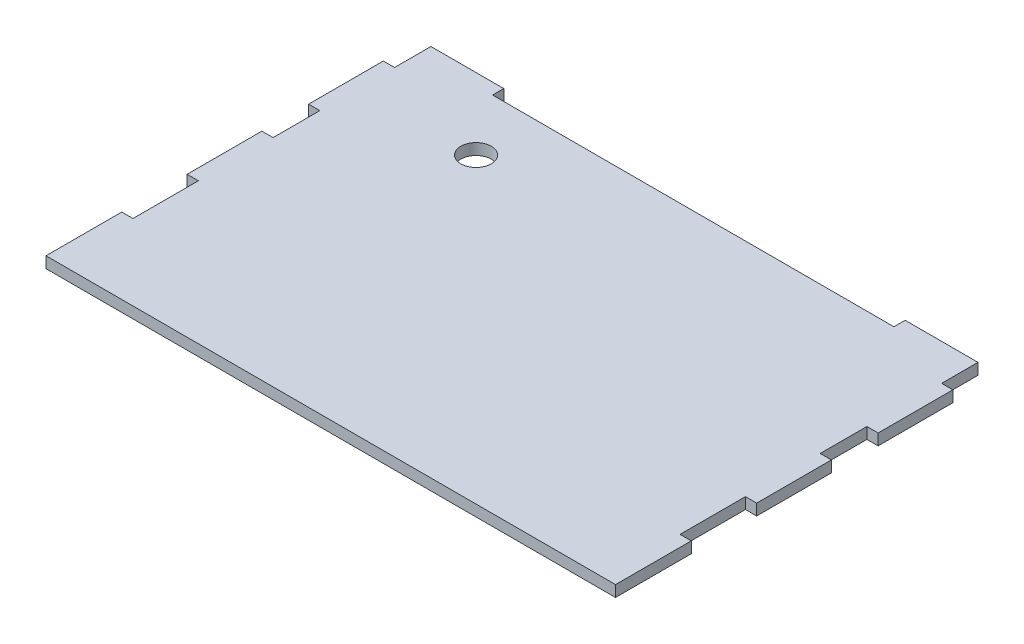
ISO-10303-21;
HEADER;
FILE_DESCRIPTION(('STEP AP214'),'2;1');
FILE_NAME('part.step','',(''),(''),'','','');
FILE_SCHEMA(('AUTOMOTIVE_DESIGN { 1 0 10303 214 1 1 1 1 }'));
ENDSEC;
DATA;
#1=APPLICATION_CONTEXT('core data for automotive mechanical design processes');
#2=APPLICATION_PROTOCOL_DEFINITION('international standard','automotive_design',2000,#1);
#3=PRODUCT_CONTEXT('',#1,'mechanical');
#4=PRODUCT('Part','Part','',(#3));
#5=PRODUCT_RELATED_PRODUCT_CATEGORY('part','',(#4));
#6=PRODUCT_DEFINITION_FORMATION('','',#4);
#7=PRODUCT_DEFINITION_CONTEXT('part definition',#1,'design');
#8=PRODUCT_DEFINITION('design','',#6,#7);
#9=PRODUCT_DEFINITION_SHAPE('','',#8);
#10=(LENGTH_UNIT() NAMED_UNIT(*) SI_UNIT(.MILLI.,.METRE.));
#11=(NAMED_UNIT(*) PLANE_ANGLE_UNIT() SI_UNIT($,.RADIAN.));
#12=(NAMED_UNIT(*) SI_UNIT($,.STERADIAN.) SOLID_ANGLE_UNIT());
#13=UNCERTAINTY_MEASURE_WITH_UNIT(LENGTH_MEASURE(1.E-05),#10,'distance_accuracy_value','');
#14=(GEOMETRIC_REPRESENTATION_CONTEXT(3) GLOBAL_UNCERTAINTY_ASSIGNED_CONTEXT((#13)) GLOBAL_UNIT_ASSIGNED_CONTEXT((#10,
#11,#12)) REPRESENTATION_CONTEXT('',''));
#15=CARTESIAN_POINT('',(0.,0.,0.));
#16=DIRECTION('',(0.,0.,1.));
#17=DIRECTION('',(1.,0.,0.));
#18=AXIS2_PLACEMENT_3D('',#15,#16,#17);
#19=CARTESIAN_POINT('',(124.827586206897,6.,95.5172413793103));
#20=DIRECTION('',(-1.,0.,0.));
#21=DIRECTION('',(0.,0.,1.));
#22=AXIS2_PLACEMENT_3D('',#19,#20,#21);
#23=PLANE('',#22);
#24=DIRECTION('',(0.,0.,-1.));
#25=VECTOR('',#24,1.);
#26=CARTESIAN_POINT('',(124.827586206897,0.,95.5172413793103));
#27=LINE('',#26,#25);
#28=CARTESIAN_POINT('',(124.827586206897,0.,95.5172413793103));
#29=VERTEX_POINT('',#28);
#30=CARTESIAN_POINT('',(124.827586206896,0.,54.9772413793103));
#31=VERTEX_POINT('',#30);
#32=EDGE_CURVE('E265',#29,#31,#27,.T.);
#33=ORIENTED_EDGE('',*,*,#32,.T.);
#34=DIRECTION('',(0.,-1.,0.));
#35=VECTOR('',#34,1.);
#36=CARTESIAN_POINT('',(124.827586206896,6.,54.9772413793103));
#37=LINE('',#36,#35);
#38=CARTESIAN_POINT('',(124.827586206896,6.,54.9772413793103));
#39=VERTEX_POINT('',#38);
#40=EDGE_CURVE('E11',#39,#31,#37,.T.);
#41=ORIENTED_EDGE('',*,*,#40,.F.);
#42=DIRECTION('',(0.,0.,-1.));
#43=VECTOR('',#42,1.);
#44=CARTESIAN_POINT('',(124.827586206897,6.,95.5172413793103));
#45=LINE('',#44,#43);
#46=CARTESIAN_POINT('',(124.827586206897,6.,95.5172413793103));
#47=VERTEX_POINT('',#46);
#48=EDGE_CURVE('E348',#47,#39,#45,.T.);
#49=ORIENTED_EDGE('',*,*,#48,.F.);
#50=DIRECTION('',(0.,-1.,0.));
#51=VECTOR('',#50,1.);
#52=CARTESIAN_POINT('',(124.827586206897,6.,95.5172413793103));
#53=LINE('',#52,#51);
#54=EDGE_CURVE('E261',#47,#29,#53,.T.);
#55=ORIENTED_EDGE('',*,*,#54,.T.);
#56=EDGE_LOOP('',(#33,#41,#49,#55));
#57=FACE_BOUND('',#56,.T.);
#58=ADVANCED_FACE('F44',(#57),#23,.F.);
#59=CARTESIAN_POINT('',(124.827586206896,6.,54.9772413793103));
#60=DIRECTION('',(0.,0.,1.));
#61=DIRECTION('',(1.,0.,0.));
#62=AXIS2_PLACEMENT_3D('',#59,#60,#61);
#63=PLANE('',#62);
#64=DIRECTION('',(-1.,0.,0.));
#65=VECTOR('',#64,1.);
#66=CARTESIAN_POINT('',(124.827586206896,0.,54.9772413793103));
#67=LINE('',#66,#65);
#68=CARTESIAN_POINT('',(118.827586206897,0.,54.9772413793103));
#69=VERTEX_POINT('',#68);
#70=EDGE_CURVE('E269',#31,#69,#67,.T.);
#71=ORIENTED_EDGE('',*,*,#70,.T.);
#72=DIRECTION('',(0.,-1.,0.));
#73=VECTOR('',#72,1.);
#74=CARTESIAN_POINT('',(118.827586206897,6.,54.9772413793103));
#75=LINE('',#74,#73);
#76=CARTESIAN_POINT('',(118.827586206897,6.,54.9772413793103));
#77=VERTEX_POINT('',#76);
#78=EDGE_CURVE('E53',#77,#69,#75,.T.);
#79=ORIENTED_EDGE('',*,*,#78,.F.);
#80=DIRECTION('',(-1.,0.,0.));
#81=VECTOR('',#80,1.);
#82=CARTESIAN_POINT('',(124.827586206896,6.,54.9772413793103));
#83=LINE('',#82,#81);
#84=EDGE_CURVE('E164',#39,#77,#83,.T.);
#85=ORIENTED_EDGE('',*,*,#84,.F.);
#86=ORIENTED_EDGE('',*,*,#40,.T.);
#87=EDGE_LOOP('',(#71,#79,#85,#86));
#88=FACE_BOUND('',#87,.T.);
#89=ADVANCED_FACE('F555',(#88),#63,.F.);
#90=CARTESIAN_POINT('',(118.827586206897,6.,54.9772413793103));
#91=DIRECTION('',(-1.,0.,0.));
#92=DIRECTION('',(0.,0.,1.));
#93=AXIS2_PLACEMENT_3D('',#90,#91,#92);
#94=PLANE('',#93);
#95=DIRECTION('',(0.,0.,-1.));
#96=VECTOR('',#95,1.);
#97=CARTESIAN_POINT('',(118.827586206897,0.,54.9772413793103));
#98=LINE('',#97,#96);
#99=CARTESIAN_POINT('',(118.827586206897,0.,19.9772413793103));
#100=VERTEX_POINT('',#99);
#101=EDGE_CURVE('E273',#69,#100,#98,.T.);
#102=ORIENTED_EDGE('',*,*,#101,.T.);
#103=DIRECTION('',(0.,-1.,0.));
#104=VECTOR('',#103,1.);
#105=CARTESIAN_POINT('',(118.827586206897,6.,19.9772413793103));
#106=LINE('',#105,#104);
#107=CARTESIAN_POINT('',(118.827586206897,6.,19.9772413793103));
#108=VERTEX_POINT('',#107);
#109=EDGE_CURVE('E439',#108,#100,#106,.T.);
#110=ORIENTED_EDGE('',*,*,#109,.F.);
#111=DIRECTION('',(0.,0.,-1.));
#112=VECTOR('',#111,1.);
#113=CARTESIAN_POINT('',(118.827586206897,6.,54.9772413793103));
#114=LINE('',#113,#112);
#115=EDGE_CURVE('E449',#77,#108,#114,.T.);
#116=ORIENTED_EDGE('',*,*,#115,.F.);
#117=ORIENTED_EDGE('',*,*,#78,.T.);
#118=EDGE_LOOP('',(#102,#110,#116,#117));
#119=FACE_BOUND('',#118,.T.);
#120=ADVANCED_FACE('F447',(#119),#94,.F.);
#121=CARTESIAN_POINT('',(118.827586206897,6.,19.9772413793103));
#122=DIRECTION('',(0.,0.,-1.));
#123=DIRECTION('',(-1.,0.,0.));
#124=AXIS2_PLACEMENT_3D('',#121,#122,#123);
#125=PLANE('',#124);
#126=DIRECTION('',(1.,0.,0.));
#127=VECTOR('',#126,1.);
#128=CARTESIAN_POINT('',(118.827586206897,0.,19.9772413793103));
#129=LINE('',#128,#127);
#130=CARTESIAN_POINT('',(124.827586206896,0.,19.9772413793103));
#131=VERTEX_POINT('',#130);
#132=EDGE_CURVE('E276',#100,#131,#129,.T.);
#133=ORIENTED_EDGE('',*,*,#132,.T.);
#134=DIRECTION('',(0.,-1.,0.));
#135=VECTOR('',#134,1.);
#136=CARTESIAN_POINT('',(124.827586206896,6.,19.9772413793103));
#137=LINE('',#136,#135);
#138=CARTESIAN_POINT('',(124.827586206896,6.,19.9772413793103));
#139=VERTEX_POINT('',#138);
#140=EDGE_CURVE('E435',#139,#131,#137,.T.);
#141=ORIENTED_EDGE('',*,*,#140,.F.);
#142=DIRECTION('',(1.,0.,0.));
#143=VECTOR('',#142,1.);
#144=CARTESIAN_POINT('',(118.827586206897,6.,19.9772413793103));
#145=LINE('',#144,#143);
#146=EDGE_CURVE('E468',#108,#139,#145,.T.);
#147=ORIENTED_EDGE('',*,*,#146,.F.);
#148=ORIENTED_EDGE('',*,*,#109,.T.);
#149=EDGE_LOOP('',(#133,#141,#147,#148));
#150=FACE_BOUND('',#149,.T.);
#151=ADVANCED_FACE('F458',(#150),#125,.F.);
#152=CARTESIAN_POINT('',(124.827586206896,6.,19.9772413793103));
#153=DIRECTION('',(-1.,0.,0.));
#154=DIRECTION('',(0.,0.,1.));
#155=AXIS2_PLACEMENT_3D('',#152,#153,#154);
#156=PLANE('',#155);
#157=DIRECTION('',(0.,0.,-1.));
#158=VECTOR('',#157,1.);
#159=CARTESIAN_POINT('',(124.827586206896,0.,19.9772413793103));
#160=LINE('',#159,#158);
#161=CARTESIAN_POINT('',(124.827586206896,0.,-20.0227586206897));
#162=VERTEX_POINT('',#161);
#163=EDGE_CURVE('E279',#131,#162,#160,.T.);
#164=ORIENTED_EDGE('',*,*,#163,.T.);
#165=DIRECTION('',(0.,-1.,0.));
#166=VECTOR('',#165,1.);
#167=CARTESIAN_POINT('',(124.827586206896,6.,-20.0227586206897));
#168=LINE('',#167,#166);
#169=CARTESIAN_POINT('',(124.827586206896,6.,-20.0227586206897));
#170=VERTEX_POINT('',#169);
#171=EDGE_CURVE('E431',#170,#162,#168,.T.);
#172=ORIENTED_EDGE('',*,*,#171,.F.);
#173=DIRECTION('',(0.,0.,-1.));
#174=VECTOR('',#173,1.);
#175=CARTESIAN_POINT('',(124.827586206896,6.,19.9772413793103));
#176=LINE('',#175,#174);
#177=EDGE_CURVE('E464',#139,#170,#176,.T.);
#178=ORIENTED_EDGE('',*,*,#177,.F.);
#179=ORIENTED_EDGE('',*,*,#140,.T.);
#180=EDGE_LOOP('',(#164,#172,#178,#179));
#181=FACE_BOUND('',#180,.T.);
#182=ADVANCED_FACE('F462',(#181),#156,.F.);
#183=CARTESIAN_POINT('',(118.827586206896,6.,-20.0227586206897));
#184=DIRECTION('',(0.,0.,1.));
#185=DIRECTION('',(1.,0.,0.));
#186=AXIS2_PLACEMENT_3D('',#183,#184,#185);
#187=PLANE('',#186);
#188=DIRECTION('',(-1.,0.,0.));
#189=VECTOR('',#188,1.);
#190=CARTESIAN_POINT('',(118.827586206896,0.,-20.0227586206897));
#191=LINE('',#190,#189);
#192=CARTESIAN_POINT('',(118.827586206896,0.,-20.0227586206897));
#193=VERTEX_POINT('',#192);
#194=EDGE_CURVE('E282',#162,#193,#191,.T.);
#195=ORIENTED_EDGE('',*,*,#194,.T.);
#196=DIRECTION('',(0.,-1.,0.));
#197=VECTOR('',#196,1.);
#198=CARTESIAN_POINT('',(118.827586206896,6.,-20.0227586206897));
#199=LINE('',#198,#197);
#200=CARTESIAN_POINT('',(118.827586206896,6.,-20.0227586206897));
#201=VERTEX_POINT('',#200);
#202=EDGE_CURVE('E427',#201,#193,#199,.T.);
#203=ORIENTED_EDGE('',*,*,#202,.F.);
#204=DIRECTION('',(-1.,0.,0.));
#205=VECTOR('',#204,1.);
#206=CARTESIAN_POINT('',(118.827586206896,6.,-20.0227586206897));
#207=LINE('',#206,#205);
#208=EDGE_CURVE('E467',#170,#201,#207,.T.);
#209=ORIENTED_EDGE('',*,*,#208,.F.);
#210=ORIENTED_EDGE('',*,*,#171,.T.);
#211=EDGE_LOOP('',(#195,#203,#209,#210));
#212=FACE_BOUND('',#211,.T.);
#213=ADVANCED_FACE('F568',(#212),#187,.F.);
#214=CARTESIAN_POINT('',(118.827586206896,6.,-45.0227586206897));
#215=DIRECTION('',(-1.,0.,0.));
#216=DIRECTION('',(0.,0.,1.));
#217=AXIS2_PLACEMENT_3D('',#214,#215,#216);
#218=PLANE('',#217);
#219=DIRECTION('',(0.,0.,-1.));
#220=VECTOR('',#219,1.);
#221=CARTESIAN_POINT('',(118.827586206896,0.,-45.0227586206897));
#222=LINE('',#221,#220);
#223=CARTESIAN_POINT('',(118.827586206896,0.,-45.0227586206897));
#224=VERTEX_POINT('',#223);
#225=EDGE_CURVE('E285',#193,#224,#222,.T.);
#226=ORIENTED_EDGE('',*,*,#225,.T.);
#227=DIRECTION('',(0.,-1.,0.));
#228=VECTOR('',#227,1.);
#229=CARTESIAN_POINT('',(118.827586206896,6.,-45.0227586206897));
#230=LINE('',#229,#228);
#231=CARTESIAN_POINT('',(118.827586206896,6.,-45.0227586206897));
#232=VERTEX_POINT('',#231);
#233=EDGE_CURVE('E423',#232,#224,#230,.T.);
#234=ORIENTED_EDGE('',*,*,#233,.F.);
#235=DIRECTION('',(0.,0.,-1.));
#236=VECTOR('',#235,1.);
#237=CARTESIAN_POINT('',(118.827586206896,6.,-45.0227586206897));
#238=LINE('',#237,#236);
#239=EDGE_CURVE('E472',#201,#232,#238,.T.);
#240=ORIENTED_EDGE('',*,*,#239,.F.);
#241=ORIENTED_EDGE('',*,*,#202,.T.);
#242=EDGE_LOOP('',(#226,#234,#240,#241));
#243=FACE_BOUND('',#242,.T.);
#244=ADVANCED_FACE('F571',(#243),#218,.F.);
#245=CARTESIAN_POINT('',(124.827586206896,6.,-45.0227586206897));
#246=DIRECTION('',(0.,0.,-1.));
#247=DIRECTION('',(-1.,0.,0.));
#248=AXIS2_PLACEMENT_3D('',#245,#246,#247);
#249=PLANE('',#248);
#250=DIRECTION('',(1.,0.,0.));
#251=VECTOR('',#250,1.);
#252=CARTESIAN_POINT('',(124.827586206896,0.,-45.0227586206897));
#253=LINE('',#252,#251);
#254=CARTESIAN_POINT('',(124.827586206896,0.,-45.0227586206897));
#255=VERTEX_POINT('',#254);
#256=EDGE_CURVE('E288',#224,#255,#253,.T.);
#257=ORIENTED_EDGE('',*,*,#256,.T.);
#258=DIRECTION('',(0.,-1.,0.));
#259=VECTOR('',#258,1.);
#260=CARTESIAN_POINT('',(124.827586206896,6.,-45.0227586206897));
#261=LINE('',#260,#259);
#262=CARTESIAN_POINT('',(124.827586206896,6.,-45.0227586206897));
#263=VERTEX_POINT('',#262);
#264=EDGE_CURVE('E419',#263,#255,#261,.T.);
#265=ORIENTED_EDGE('',*,*,#264,.F.);
#266=DIRECTION('',(1.,0.,0.));
#267=VECTOR('',#266,1.);
#268=CARTESIAN_POINT('',(124.827586206896,6.,-45.0227586206897));
#269=LINE('',#268,#267);
#270=EDGE_CURVE('E479',#232,#263,#269,.T.);
#271=ORIENTED_EDGE('',*,*,#270,.F.);
#272=ORIENTED_EDGE('',*,*,#233,.T.);
#273=EDGE_LOOP('',(#257,#265,#271,#272));
#274=FACE_BOUND('',#273,.T.);
#275=ADVANCED_FACE('F575',(#274),#249,.F.);
#276=CARTESIAN_POINT('',(124.827586206896,6.,-45.0227586206897));
#277=DIRECTION('',(-1.,0.,0.));
#278=DIRECTION('',(0.,0.,1.));
#279=AXIS2_PLACEMENT_3D('',#276,#277,#278);
#280=PLANE('',#279);
#281=DIRECTION('',(0.,0.,-1.));
#282=VECTOR('',#281,1.);
#283=CARTESIAN_POINT('',(124.827586206896,0.,-45.0227586206897));
#284=LINE('',#283,#282);
#285=CARTESIAN_POINT('',(124.827586206896,0.,-85.0227586206897));
#286=VERTEX_POINT('',#285);
#287=EDGE_CURVE('E291',#255,#286,#284,.T.);
#288=ORIENTED_EDGE('',*,*,#287,.T.);
#289=DIRECTION('',(0.,-1.,0.));
#290=VECTOR('',#289,1.);
#291=CARTESIAN_POINT('',(124.827586206896,6.,-85.0227586206897));
#292=LINE('',#291,#290);
#293=CARTESIAN_POINT('',(124.827586206896,6.,-85.0227586206897));
#294=VERTEX_POINT('',#293);
#295=EDGE_CURVE('E415',#294,#286,#292,.T.);
#296=ORIENTED_EDGE('',*,*,#295,.F.);
#297=DIRECTION('',(0.,0.,-1.));
#298=VECTOR('',#297,1.);
#299=CARTESIAN_POINT('',(124.827586206896,6.,-45.0227586206897));
#300=LINE('',#299,#298);
#301=EDGE_CURVE('E482',#263,#294,#300,.T.);
#302=ORIENTED_EDGE('',*,*,#301,.F.);
#303=ORIENTED_EDGE('',*,*,#264,.T.);
#304=EDGE_LOOP('',(#288,#296,#302,#303));
#305=FACE_BOUND('',#304,.T.);
#306=ADVANCED_FACE('F579',(#305),#280,.F.);
#307=CARTESIAN_POINT('',(118.827586206896,6.,-85.0227586206897));
#308=DIRECTION('',(0.,0.,1.));
#309=DIRECTION('',(1.,0.,0.));
#310=AXIS2_PLACEMENT_3D('',#307,#308,#309);
#311=PLANE('',#310);
#312=DIRECTION('',(-1.,0.,0.));
#313=VECTOR('',#312,1.);
#314=CARTESIAN_POINT('',(118.827586206896,0.,-85.0227586206897));
#315=LINE('',#314,#313);
#316=CARTESIAN_POINT('',(118.827586206896,0.,-85.0227586206897));
#317=VERTEX_POINT('',#316);
#318=EDGE_CURVE('E294',#286,#317,#315,.T.);
#319=ORIENTED_EDGE('',*,*,#318,.T.);
#320=DIRECTION('',(0.,-1.,0.));
#321=VECTOR('',#320,1.);
#322=CARTESIAN_POINT('',(118.827586206896,6.,-85.0227586206897));
#323=LINE('',#322,#321);
#324=CARTESIAN_POINT('',(118.827586206896,6.,-85.0227586206897));
#325=VERTEX_POINT('',#324);
#326=EDGE_CURVE('E411',#325,#317,#323,.T.);
#327=ORIENTED_EDGE('',*,*,#326,.F.);
#328=DIRECTION('',(-1.,0.,0.));
#329=VECTOR('',#328,1.);
#330=CARTESIAN_POINT('',(118.827586206896,6.,-85.0227586206897));
#331=LINE('',#330,#329);
#332=EDGE_CURVE('E485',#294,#325,#331,.T.);
#333=ORIENTED_EDGE('',*,*,#332,.F.);
#334=ORIENTED_EDGE('',*,*,#295,.T.);
#335=EDGE_LOOP('',(#319,#327,#333,#334));
#336=FACE_BOUND('',#335,.T.);
#337=ADVANCED_FACE('F583',(#336),#311,.F.);
#338=CARTESIAN_POINT('',(118.827586206896,6.,-104.48275862069));
#339=DIRECTION('',(-1.,0.,0.));
#340=DIRECTION('',(0.,0.,1.));
#341=AXIS2_PLACEMENT_3D('',#338,#339,#340);
#342=PLANE('',#341);
#343=DIRECTION('',(0.,0.,-1.));
#344=VECTOR('',#343,1.);
#345=CARTESIAN_POINT('',(118.827586206896,0.,-104.48275862069));
#346=LINE('',#345,#344);
#347=CARTESIAN_POINT('',(118.827586206896,0.,-104.48275862069));
#348=VERTEX_POINT('',#347);
#349=EDGE_CURVE('E297',#317,#348,#346,.T.);
#350=ORIENTED_EDGE('',*,*,#349,.T.);
#351=DIRECTION('',(0.,-1.,0.));
#352=VECTOR('',#351,1.);
#353=CARTESIAN_POINT('',(118.827586206896,6.,-104.48275862069));
#354=LINE('',#353,#352);
#355=CARTESIAN_POINT('',(118.827586206896,6.,-104.48275862069));
#356=VERTEX_POINT('',#355);
#357=EDGE_CURVE('E407',#356,#348,#354,.T.);
#358=ORIENTED_EDGE('',*,*,#357,.F.);
#359=DIRECTION('',(0.,0.,-1.));
#360=VECTOR('',#359,1.);
#361=CARTESIAN_POINT('',(118.827586206896,6.,-104.48275862069));
#362=LINE('',#361,#360);
#363=EDGE_CURVE('E488',#325,#356,#362,.T.);
#364=ORIENTED_EDGE('',*,*,#363,.F.);
#365=ORIENTED_EDGE('',*,*,#326,.T.);
#366=EDGE_LOOP('',(#350,#358,#364,#365));
#367=FACE_BOUND('',#366,.T.);
#368=ADVANCED_FACE('F587',(#367),#342,.F.);
#369=CARTESIAN_POINT('',(118.827586206896,6.,-104.48275862069));
#370=DIRECTION('',(0.,0.,1.));
#371=DIRECTION('',(1.,0.,0.));
#372=AXIS2_PLACEMENT_3D('',#369,#370,#371);
#373=PLANE('',#372);
#374=DIRECTION('',(-1.,0.,0.));
#375=VECTOR('',#374,1.);
#376=CARTESIAN_POINT('',(118.827586206896,0.,-104.48275862069));
#377=LINE('',#376,#375);
#378=CARTESIAN_POINT('',(79.8275862068965,0.,-104.48275862069));
#379=VERTEX_POINT('',#378);
#380=EDGE_CURVE('E300',#348,#379,#377,.T.);
#381=ORIENTED_EDGE('',*,*,#380,.T.);
#382=DIRECTION('',(0.,-1.,0.));
#383=VECTOR('',#382,1.);
#384=CARTESIAN_POINT('',(79.8275862068965,6.,-104.48275862069));
#385=LINE('',#384,#383);
#386=CARTESIAN_POINT('',(79.8275862068965,6.,-104.48275862069));
#387=VERTEX_POINT('',#386);
#388=EDGE_CURVE('E403',#387,#379,#385,.T.);
#389=ORIENTED_EDGE('',*,*,#388,.F.);
#390=DIRECTION('',(-1.,0.,0.));
#391=VECTOR('',#390,1.);
#392=CARTESIAN_POINT('',(118.827586206896,6.,-104.48275862069));
#393=LINE('',#392,#391);
#394=EDGE_CURVE('E491',#356,#387,#393,.T.);
#395=ORIENTED_EDGE('',*,*,#394,.F.);
#396=ORIENTED_EDGE('',*,*,#357,.T.);
#397=EDGE_LOOP('',(#381,#389,#395,#396));
#398=FACE_BOUND('',#397,.T.);
#399=ADVANCED_FACE('F591',(#398),#373,.F.);
#400=CARTESIAN_POINT('',(79.8275862068965,6.,-104.48275862069));
#401=DIRECTION('',(1.,0.,0.));
#402=DIRECTION('',(0.,0.,-1.));
#403=AXIS2_PLACEMENT_3D('',#400,#401,#402);
#404=PLANE('',#403);
#405=DIRECTION('',(0.,0.,1.));
#406=VECTOR('',#405,1.);
#407=CARTESIAN_POINT('',(79.8275862068965,0.,-104.48275862069));
#408=LINE('',#407,#406);
#409=CARTESIAN_POINT('',(79.8275862068965,0.,-98.4827586206897));
#410=VERTEX_POINT('',#409);
#411=EDGE_CURVE('E303',#379,#410,#408,.T.);
#412=ORIENTED_EDGE('',*,*,#411,.T.);
#413=DIRECTION('',(0.,-1.,0.));
#414=VECTOR('',#413,1.);
#415=CARTESIAN_POINT('',(79.8275862068965,6.,-98.4827586206897));
#416=LINE('',#415,#414);
#417=CARTESIAN_POINT('',(79.8275862068965,6.,-98.4827586206897));
#418=VERTEX_POINT('',#417);
#419=EDGE_CURVE('E399',#418,#410,#416,.T.);
#420=ORIENTED_EDGE('',*,*,#419,.F.);
#421=DIRECTION('',(0.,0.,1.));
#422=VECTOR('',#421,1.);
#423=CARTESIAN_POINT('',(79.8275862068965,6.,-104.48275862069));
#424=LINE('',#423,#422);
#425=EDGE_CURVE('E494',#387,#418,#424,.T.);
#426=ORIENTED_EDGE('',*,*,#425,.F.);
#427=ORIENTED_EDGE('',*,*,#388,.T.);
#428=EDGE_LOOP('',(#412,#420,#426,#427));
#429=FACE_BOUND('',#428,.T.);
#430=ADVANCED_FACE('F595',(#429),#404,.F.);
#431=CARTESIAN_POINT('',(79.8275862068965,6.,-98.4827586206897));
#432=DIRECTION('',(0.,0.,1.));
#433=DIRECTION('',(1.,0.,0.));
#434=AXIS2_PLACEMENT_3D('',#431,#432,#433);
#435=PLANE('',#434);
#436=DIRECTION('',(-1.,0.,0.));
#437=VECTOR('',#436,1.);
#438=CARTESIAN_POINT('',(79.8275862068965,0.,-98.4827586206897));
#439=LINE('',#438,#437);
#440=CARTESIAN_POINT('',(-134.972413793103,0.,-98.4827586206897));
#441=VERTEX_POINT('',#440);
#442=EDGE_CURVE('E306',#410,#441,#439,.T.);
#443=ORIENTED_EDGE('',*,*,#442,.T.);
#444=DIRECTION('',(0.,-1.,0.));
#445=VECTOR('',#444,1.);
#446=CARTESIAN_POINT('',(-134.972413793103,6.,-98.4827586206897));
#447=LINE('',#446,#445);
#448=CARTESIAN_POINT('',(-134.972413793103,6.,-98.4827586206897));
#449=VERTEX_POINT('',#448);
#450=EDGE_CURVE('E395',#449,#441,#447,.T.);
#451=ORIENTED_EDGE('',*,*,#450,.F.);
#452=DIRECTION('',(-1.,0.,0.));
#453=VECTOR('',#452,1.);
#454=CARTESIAN_POINT('',(79.8275862068965,6.,-98.4827586206897));
#455=LINE('',#454,#453);
#456=EDGE_CURVE('E497',#418,#449,#455,.T.);
#457=ORIENTED_EDGE('',*,*,#456,.F.);
#458=ORIENTED_EDGE('',*,*,#419,.T.);
#459=EDGE_LOOP('',(#443,#451,#457,#458));
#460=FACE_BOUND('',#459,.T.);
#461=ADVANCED_FACE('F599',(#460),#435,.F.);
#462=CARTESIAN_POINT('',(-134.972413793103,6.,-98.4827586206897));
#463=DIRECTION('',(-1.,0.,0.));
#464=DIRECTION('',(0.,0.,1.));
#465=AXIS2_PLACEMENT_3D('',#462,#463,#464);
#466=PLANE('',#465);
#467=DIRECTION('',(0.,0.,-1.));
#468=VECTOR('',#467,1.);
#469=CARTESIAN_POINT('',(-134.972413793103,0.,-98.4827586206897));
#470=LINE('',#469,#468);
#471=CARTESIAN_POINT('',(-134.972413793103,0.,-104.48275862069));
#472=VERTEX_POINT('',#471);
#473=EDGE_CURVE('E309',#441,#472,#470,.T.);
#474=ORIENTED_EDGE('',*,*,#473,.T.);
#475=DIRECTION('',(0.,-1.,0.));
#476=VECTOR('',#475,1.);
#477=CARTESIAN_POINT('',(-134.972413793103,6.,-104.48275862069));
#478=LINE('',#477,#476);
#479=CARTESIAN_POINT('',(-134.972413793103,6.,-104.48275862069));
#480=VERTEX_POINT('',#479);
#481=EDGE_CURVE('E391',#480,#472,#478,.T.);
#482=ORIENTED_EDGE('',*,*,#481,.F.);
#483=DIRECTION('',(0.,0.,-1.));
#484=VECTOR('',#483,1.);
#485=CARTESIAN_POINT('',(-134.972413793103,6.,-98.4827586206897));
#486=LINE('',#485,#484);
#487=EDGE_CURVE('E500',#449,#480,#486,.T.);
#488=ORIENTED_EDGE('',*,*,#487,.F.);
#489=ORIENTED_EDGE('',*,*,#450,.T.);
#490=EDGE_LOOP('',(#474,#482,#488,#489));
#491=FACE_BOUND('',#490,.T.);
#492=ADVANCED_FACE('F603',(#491),#466,.F.);
#493=CARTESIAN_POINT('',(-134.972413793103,6.,-104.48275862069));
#494=DIRECTION('',(0.,0.,1.));
#495=DIRECTION('',(1.,0.,0.));
#496=AXIS2_PLACEMENT_3D('',#493,#494,#495);
#497=PLANE('',#496);
#498=DIRECTION('',(-1.,0.,0.));
#499=VECTOR('',#498,1.);
#500=CARTESIAN_POINT('',(-134.972413793103,0.,-104.48275862069));
#501=LINE('',#500,#499);
#502=CARTESIAN_POINT('',(-173.972413793103,0.,-104.48275862069));
#503=VERTEX_POINT('',#502);
#504=EDGE_CURVE('E312',#472,#503,#501,.T.);
#505=ORIENTED_EDGE('',*,*,#504,.T.);
#506=DIRECTION('',(0.,-1.,0.));
#507=VECTOR('',#506,1.);
#508=CARTESIAN_POINT('',(-173.972413793103,6.,-104.48275862069));
#509=LINE('',#508,#507);
#510=CARTESIAN_POINT('',(-173.972413793103,6.,-104.48275862069));
#511=VERTEX_POINT('',#510);
#512=EDGE_CURVE('E387',#511,#503,#509,.T.);
#513=ORIENTED_EDGE('',*,*,#512,.F.);
#514=DIRECTION('',(-1.,0.,0.));
#515=VECTOR('',#514,1.);
#516=CARTESIAN_POINT('',(-134.972413793103,6.,-104.48275862069));
#517=LINE('',#516,#515);
#518=EDGE_CURVE('E503',#480,#511,#517,.T.);
#519=ORIENTED_EDGE('',*,*,#518,.F.);
#520=ORIENTED_EDGE('',*,*,#481,.T.);
#521=EDGE_LOOP('',(#505,#513,#519,#520));
#522=FACE_BOUND('',#521,.T.);
#523=ADVANCED_FACE('F607',(#522),#497,.F.);
#524=CARTESIAN_POINT('',(-173.972413793103,6.,-104.48275862069));
#525=DIRECTION('',(1.,0.,0.));
#526=DIRECTION('',(0.,0.,-1.));
#527=AXIS2_PLACEMENT_3D('',#524,#525,#526);
#528=PLANE('',#527);
#529=DIRECTION('',(0.,0.,1.));
#530=VECTOR('',#529,1.);
#531=CARTESIAN_POINT('',(-173.972413793103,0.,-104.48275862069));
#532=LINE('',#531,#530);
#533=CARTESIAN_POINT('',(-173.972413793103,0.,-85.0227586206897));
#534=VERTEX_POINT('',#533);
#535=EDGE_CURVE('E315',#503,#534,#532,.T.);
#536=ORIENTED_EDGE('',*,*,#535,.T.);
#537=DIRECTION('',(0.,-1.,0.));
#538=VECTOR('',#537,1.);
#539=CARTESIAN_POINT('',(-173.972413793103,6.,-85.0227586206897));
#540=LINE('',#539,#538);
#541=CARTESIAN_POINT('',(-173.972413793103,6.,-85.0227586206897));
#542=VERTEX_POINT('',#541);
#543=EDGE_CURVE('E383',#542,#534,#540,.T.);
#544=ORIENTED_EDGE('',*,*,#543,.F.);
#545=DIRECTION('',(0.,0.,1.));
#546=VECTOR('',#545,1.);
#547=CARTESIAN_POINT('',(-173.972413793103,6.,-104.48275862069));
#548=LINE('',#547,#546);
#549=EDGE_CURVE('E506',#511,#542,#548,.T.);
#550=ORIENTED_EDGE('',*,*,#549,.F.);
#551=ORIENTED_EDGE('',*,*,#512,.T.);
#552=EDGE_LOOP('',(#536,#544,#550,#551));
#553=FACE_BOUND('',#552,.T.);
#554=ADVANCED_FACE('F611',(#553),#528,.F.);
#555=CARTESIAN_POINT('',(-173.972413793103,6.,-85.0227586206897));
#556=DIRECTION('',(0.,0.,1.));
#557=DIRECTION('',(1.,0.,0.));
#558=AXIS2_PLACEMENT_3D('',#555,#556,#557);
#559=PLANE('',#558);
#560=DIRECTION('',(-1.,0.,0.));
#561=VECTOR('',#560,1.);
#562=CARTESIAN_POINT('',(-173.972413793103,0.,-85.0227586206897));
#563=LINE('',#562,#561);
#564=CARTESIAN_POINT('',(-179.972413793103,0.,-85.0227586206897));
#565=VERTEX_POINT('',#564);
#566=EDGE_CURVE('E318',#534,#565,#563,.T.);
#567=ORIENTED_EDGE('',*,*,#566,.T.);
#568=DIRECTION('',(0.,-1.,0.));
#569=VECTOR('',#568,1.);
#570=CARTESIAN_POINT('',(-179.972413793103,6.,-85.0227586206897));
#571=LINE('',#570,#569);
#572=CARTESIAN_POINT('',(-179.972413793103,6.,-85.0227586206897));
#573=VERTEX_POINT('',#572);
#574=EDGE_CURVE('E379',#573,#565,#571,.T.);
#575=ORIENTED_EDGE('',*,*,#574,.F.);
#576=DIRECTION('',(-1.,0.,0.));
#577=VECTOR('',#576,1.);
#578=CARTESIAN_POINT('',(-173.972413793103,6.,-85.0227586206897));
#579=LINE('',#578,#577);
#580=EDGE_CURVE('E509',#542,#573,#579,.T.);
#581=ORIENTED_EDGE('',*,*,#580,.F.);
#582=ORIENTED_EDGE('',*,*,#543,.T.);
#583=EDGE_LOOP('',(#567,#575,#581,#582));
#584=FACE_BOUND('',#583,.T.);
#585=ADVANCED_FACE('F615',(#584),#559,.F.);
#586=CARTESIAN_POINT('',(-179.972413793103,6.,-45.0227586206897));
#587=DIRECTION('',(1.,0.,0.));
#588=DIRECTION('',(0.,0.,-1.));
#589=AXIS2_PLACEMENT_3D('',#586,#587,#588);
#590=PLANE('',#589);
#591=DIRECTION('',(0.,0.,1.));
#592=VECTOR('',#591,1.);
#593=CARTESIAN_POINT('',(-179.972413793103,0.,-45.0227586206897));
#594=LINE('',#593,#592);
#595=CARTESIAN_POINT('',(-179.972413793103,0.,-45.0227586206897));
#596=VERTEX_POINT('',#595);
#597=EDGE_CURVE('E321',#565,#596,#594,.T.);
#598=ORIENTED_EDGE('',*,*,#597,.T.);
#599=DIRECTION('',(0.,-1.,0.));
#600=VECTOR('',#599,1.);
#601=CARTESIAN_POINT('',(-179.972413793103,6.,-45.0227586206897));
#602=LINE('',#601,#600);
#603=CARTESIAN_POINT('',(-179.972413793103,6.,-45.0227586206897));
#604=VERTEX_POINT('',#603);
#605=EDGE_CURVE('E375',#604,#596,#602,.T.);
#606=ORIENTED_EDGE('',*,*,#605,.F.);
#607=DIRECTION('',(0.,0.,1.));
#608=VECTOR('',#607,1.);
#609=CARTESIAN_POINT('',(-179.972413793103,6.,-45.0227586206897));
#610=LINE('',#609,#608);
#611=EDGE_CURVE('E512',#573,#604,#610,.T.);
#612=ORIENTED_EDGE('',*,*,#611,.F.);
#613=ORIENTED_EDGE('',*,*,#574,.T.);
#614=EDGE_LOOP('',(#598,#606,#612,#613));
#615=FACE_BOUND('',#614,.T.);
#616=ADVANCED_FACE('F619',(#615),#590,.F.);
#617=CARTESIAN_POINT('',(-179.972413793103,6.,-45.0227586206897));
#618=DIRECTION('',(0.,0.,-1.));
#619=DIRECTION('',(-1.,0.,0.));
#620=AXIS2_PLACEMENT_3D('',#617,#618,#619);
#621=PLANE('',#620);
#622=DIRECTION('',(1.,0.,0.));
#623=VECTOR('',#622,1.);
#624=CARTESIAN_POINT('',(-179.972413793103,0.,-45.0227586206897));
#625=LINE('',#624,#623);
#626=CARTESIAN_POINT('',(-173.972413793103,0.,-45.0227586206897));
#627=VERTEX_POINT('',#626);
#628=EDGE_CURVE('E324',#596,#627,#625,.T.);
#629=ORIENTED_EDGE('',*,*,#628,.T.);
#630=DIRECTION('',(0.,-1.,0.));
#631=VECTOR('',#630,1.);
#632=CARTESIAN_POINT('',(-173.972413793103,6.,-45.0227586206897));
#633=LINE('',#632,#631);
#634=CARTESIAN_POINT('',(-173.972413793103,6.,-45.0227586206897));
#635=VERTEX_POINT('',#634);
#636=EDGE_CURVE('E371',#635,#627,#633,.T.);
#637=ORIENTED_EDGE('',*,*,#636,.F.);
#638=DIRECTION('',(1.,0.,0.));
#639=VECTOR('',#638,1.);
#640=CARTESIAN_POINT('',(-179.972413793103,6.,-45.0227586206897));
#641=LINE('',#640,#639);
#642=EDGE_CURVE('E515',#604,#635,#641,.T.);
#643=ORIENTED_EDGE('',*,*,#642,.F.);
#644=ORIENTED_EDGE('',*,*,#605,.T.);
#645=EDGE_LOOP('',(#629,#637,#643,#644));
#646=FACE_BOUND('',#645,.T.);
#647=ADVANCED_FACE('F623',(#646),#621,.F.);
#648=CARTESIAN_POINT('',(-173.972413793103,6.,-45.0227586206897));
#649=DIRECTION('',(1.,0.,0.));
#650=DIRECTION('',(0.,0.,-1.));
#651=AXIS2_PLACEMENT_3D('',#648,#649,#650);
#652=PLANE('',#651);
#653=DIRECTION('',(0.,0.,1.));
#654=VECTOR('',#653,1.);
#655=CARTESIAN_POINT('',(-173.972413793103,0.,-45.0227586206897));
#656=LINE('',#655,#654);
#657=CARTESIAN_POINT('',(-173.972413793103,0.,-20.0227586206897));
#658=VERTEX_POINT('',#657);
#659=EDGE_CURVE('E327',#627,#658,#656,.T.);
#660=ORIENTED_EDGE('',*,*,#659,.T.);
#661=DIRECTION('',(0.,-1.,0.));
#662=VECTOR('',#661,1.);
#663=CARTESIAN_POINT('',(-173.972413793103,6.,-20.0227586206897));
#664=LINE('',#663,#662);
#665=CARTESIAN_POINT('',(-173.972413793103,6.,-20.0227586206897));
#666=VERTEX_POINT('',#665);
#667=EDGE_CURVE('E367',#666,#658,#664,.T.);
#668=ORIENTED_EDGE('',*,*,#667,.F.);
#669=DIRECTION('',(0.,0.,1.));
#670=VECTOR('',#669,1.);
#671=CARTESIAN_POINT('',(-173.972413793103,6.,-45.0227586206897));
#672=LINE('',#671,#670);
#673=EDGE_CURVE('E518',#635,#666,#672,.T.);
#674=ORIENTED_EDGE('',*,*,#673,.F.);
#675=ORIENTED_EDGE('',*,*,#636,.T.);
#676=EDGE_LOOP('',(#660,#668,#674,#675));
#677=FACE_BOUND('',#676,.T.);
#678=ADVANCED_FACE('F627',(#677),#652,.F.);
#679=CARTESIAN_POINT('',(-173.972413793103,6.,-20.0227586206897));
#680=DIRECTION('',(0.,0.,1.));
#681=DIRECTION('',(1.,0.,0.));
#682=AXIS2_PLACEMENT_3D('',#679,#680,#681);
#683=PLANE('',#682);
#684=DIRECTION('',(-1.,0.,0.));
#685=VECTOR('',#684,1.);
#686=CARTESIAN_POINT('',(-173.972413793103,0.,-20.0227586206897));
#687=LINE('',#686,#685);
#688=CARTESIAN_POINT('',(-179.972413793103,0.,-20.0227586206897));
#689=VERTEX_POINT('',#688);
#690=EDGE_CURVE('E330',#658,#689,#687,.T.);
#691=ORIENTED_EDGE('',*,*,#690,.T.);
#692=DIRECTION('',(0.,-1.,0.));
#693=VECTOR('',#692,1.);
#694=CARTESIAN_POINT('',(-179.972413793103,6.,-20.0227586206897));
#695=LINE('',#694,#693);
#696=CARTESIAN_POINT('',(-179.972413793103,6.,-20.0227586206897));
#697=VERTEX_POINT('',#696);
#698=EDGE_CURVE('E363',#697,#689,#695,.T.);
#699=ORIENTED_EDGE('',*,*,#698,.F.);
#700=DIRECTION('',(-1.,0.,0.));
#701=VECTOR('',#700,1.);
#702=CARTESIAN_POINT('',(-173.972413793103,6.,-20.0227586206897));
#703=LINE('',#702,#701);
#704=EDGE_CURVE('E521',#666,#697,#703,.T.);
#705=ORIENTED_EDGE('',*,*,#704,.F.);
#706=ORIENTED_EDGE('',*,*,#667,.T.);
#707=EDGE_LOOP('',(#691,#699,#705,#706));
#708=FACE_BOUND('',#707,.T.);
#709=ADVANCED_FACE('F631',(#708),#683,.F.);
#710=CARTESIAN_POINT('',(-179.972413793103,6.,19.9772413793103));
#711=DIRECTION('',(1.,0.,0.));
#712=DIRECTION('',(0.,0.,-1.));
#713=AXIS2_PLACEMENT_3D('',#710,#711,#712);
#714=PLANE('',#713);
#715=DIRECTION('',(0.,0.,1.));
#716=VECTOR('',#715,1.);
#717=CARTESIAN_POINT('',(-179.972413793103,0.,19.9772413793103));
#718=LINE('',#717,#716);
#719=CARTESIAN_POINT('',(-179.972413793103,0.,19.9772413793103));
#720=VERTEX_POINT('',#719);
#721=EDGE_CURVE('E333',#689,#720,#718,.T.);
#722=ORIENTED_EDGE('',*,*,#721,.T.);
#723=DIRECTION('',(0.,-1.,0.));
#724=VECTOR('',#723,1.);
#725=CARTESIAN_POINT('',(-179.972413793103,6.,19.9772413793103));
#726=LINE('',#725,#724);
#727=CARTESIAN_POINT('',(-179.972413793103,6.,19.9772413793103));
#728=VERTEX_POINT('',#727);
#729=EDGE_CURVE('E359',#728,#720,#726,.T.);
#730=ORIENTED_EDGE('',*,*,#729,.F.);
#731=DIRECTION('',(0.,0.,1.));
#732=VECTOR('',#731,1.);
#733=CARTESIAN_POINT('',(-179.972413793103,6.,19.9772413793103));
#734=LINE('',#733,#732);
#735=EDGE_CURVE('E524',#697,#728,#734,.T.);
#736=ORIENTED_EDGE('',*,*,#735,.F.);
#737=ORIENTED_EDGE('',*,*,#698,.T.);
#738=EDGE_LOOP('',(#722,#730,#736,#737));
#739=FACE_BOUND('',#738,.T.);
#740=ADVANCED_FACE('F635',(#739),#714,.F.);
#741=CARTESIAN_POINT('',(-173.972413793103,6.,19.9772413793103));
#742=DIRECTION('',(0.,0.,-1.));
#743=DIRECTION('',(-1.,0.,0.));
#744=AXIS2_PLACEMENT_3D('',#741,#742,#743);
#745=PLANE('',#744);
#746=DIRECTION('',(1.,0.,0.));
#747=VECTOR('',#746,1.);
#748=CARTESIAN_POINT('',(-173.972413793103,0.,19.9772413793103));
#749=LINE('',#748,#747);
#750=CARTESIAN_POINT('',(-173.972413793103,0.,19.9772413793103));
#751=VERTEX_POINT('',#750);
#752=EDGE_CURVE('E336',#720,#751,#749,.T.);
#753=ORIENTED_EDGE('',*,*,#752,.T.);
#754=DIRECTION('',(0.,-1.,0.));
#755=VECTOR('',#754,1.);
#756=CARTESIAN_POINT('',(-173.972413793103,6.,19.9772413793103));
#757=LINE('',#756,#755);
#758=CARTESIAN_POINT('',(-173.972413793103,6.,19.9772413793103));
#759=VERTEX_POINT('',#758);
#760=EDGE_CURVE('E355',#759,#751,#757,.T.);
#761=ORIENTED_EDGE('',*,*,#760,.F.);
#762=DIRECTION('',(1.,0.,0.));
#763=VECTOR('',#762,1.);
#764=CARTESIAN_POINT('',(-173.972413793103,6.,19.9772413793103));
#765=LINE('',#764,#763);
#766=EDGE_CURVE('E527',#728,#759,#765,.T.);
#767=ORIENTED_EDGE('',*,*,#766,.F.);
#768=ORIENTED_EDGE('',*,*,#729,.T.);
#769=EDGE_LOOP('',(#753,#761,#767,#768));
#770=FACE_BOUND('',#769,.T.);
#771=ADVANCED_FACE('F535',(#770),#745,.F.);
#772=CARTESIAN_POINT('',(-173.972413793103,6.,54.9772413793103));
#773=DIRECTION('',(1.,0.,0.));
#774=DIRECTION('',(0.,0.,-1.));
#775=AXIS2_PLACEMENT_3D('',#772,#773,#774);
#776=PLANE('',#775);
#777=DIRECTION('',(0.,0.,1.));
#778=VECTOR('',#777,1.);
#779=CARTESIAN_POINT('',(-173.972413793103,0.,54.9772413793103));
#780=LINE('',#779,#778);
#781=CARTESIAN_POINT('',(-173.972413793103,0.,54.9772413793103));
#782=VERTEX_POINT('',#781);
#783=EDGE_CURVE('E339',#751,#782,#780,.T.);
#784=ORIENTED_EDGE('',*,*,#783,.T.);
#785=DIRECTION('',(0.,-1.,0.));
#786=VECTOR('',#785,1.);
#787=CARTESIAN_POINT('',(-173.972413793103,6.,54.9772413793103));
#788=LINE('',#787,#786);
#789=CARTESIAN_POINT('',(-173.972413793103,6.,54.9772413793103));
#790=VERTEX_POINT('',#789);
#791=EDGE_CURVE('E254',#790,#782,#788,.T.);
#792=ORIENTED_EDGE('',*,*,#791,.F.);
#793=DIRECTION('',(0.,0.,1.));
#794=VECTOR('',#793,1.);
#795=CARTESIAN_POINT('',(-173.972413793103,6.,54.9772413793103));
#796=LINE('',#795,#794);
#797=EDGE_CURVE('E243',#759,#790,#796,.T.);
#798=ORIENTED_EDGE('',*,*,#797,.F.);
#799=ORIENTED_EDGE('',*,*,#760,.T.);
#800=EDGE_LOOP('',(#784,#792,#798,#799));
#801=FACE_BOUND('',#800,.T.);
#802=ADVANCED_FACE('F539',(#801),#776,.F.);
#803=CARTESIAN_POINT('',(-179.972413793103,6.,54.9772413793103));
#804=DIRECTION('',(0.,0.,1.));
#805=DIRECTION('',(1.,0.,0.));
#806=AXIS2_PLACEMENT_3D('',#803,#804,#805);
#807=PLANE('',#806);
#808=DIRECTION('',(-1.,0.,0.));
#809=VECTOR('',#808,1.);
#810=CARTESIAN_POINT('',(-179.972413793103,0.,54.9772413793103));
#811=LINE('',#810,#809);
#812=CARTESIAN_POINT('',(-179.972413793103,0.,54.9772413793103));
#813=VERTEX_POINT('',#812);
#814=EDGE_CURVE('E252',#782,#813,#811,.T.);
#815=ORIENTED_EDGE('',*,*,#814,.T.);
#816=DIRECTION('',(0.,-1.,0.));
#817=VECTOR('',#816,1.);
#818=CARTESIAN_POINT('',(-179.972413793103,6.,54.9772413793103));
#819=LINE('',#818,#817);
#820=CARTESIAN_POINT('',(-179.972413793103,6.,54.9772413793103));
#821=VERTEX_POINT('',#820);
#822=EDGE_CURVE('E249',#821,#813,#819,.T.);
#823=ORIENTED_EDGE('',*,*,#822,.F.);
#824=DIRECTION('',(-1.,0.,0.));
#825=VECTOR('',#824,1.);
#826=CARTESIAN_POINT('',(-179.972413793103,6.,54.9772413793103));
#827=LINE('',#826,#825);
#828=EDGE_CURVE('E237',#790,#821,#827,.T.);
#829=ORIENTED_EDGE('',*,*,#828,.F.);
#830=ORIENTED_EDGE('',*,*,#791,.T.);
#831=EDGE_LOOP('',(#815,#823,#829,#830));
#832=FACE_BOUND('',#831,.T.);
#833=ADVANCED_FACE('F250',(#832),#807,.F.);
#834=CARTESIAN_POINT('',(-179.972413793103,6.,95.5172413793104));
#835=DIRECTION('',(1.,0.,0.));
#836=DIRECTION('',(0.,0.,-1.));
#837=AXIS2_PLACEMENT_3D('',#834,#835,#836);
#838=PLANE('',#837);
#839=DIRECTION('',(0.,0.,1.));
#840=VECTOR('',#839,1.);
#841=CARTESIAN_POINT('',(-179.972413793103,0.,95.5172413793104));
#842=LINE('',#841,#840);
#843=CARTESIAN_POINT('',(-179.972413793103,0.,95.5172413793104));
#844=VERTEX_POINT('',#843);
#845=EDGE_CURVE('E150',#813,#844,#842,.T.);
#846=ORIENTED_EDGE('',*,*,#845,.T.);
#847=DIRECTION('',(0.,-1.,0.));
#848=VECTOR('',#847,1.);
#849=CARTESIAN_POINT('',(-179.972413793103,6.,95.5172413793104));
#850=LINE('',#849,#848);
#851=CARTESIAN_POINT('',(-179.972413793103,6.,95.5172413793104));
#852=VERTEX_POINT('',#851);
#853=EDGE_CURVE('E255',#852,#844,#850,.T.);
#854=ORIENTED_EDGE('',*,*,#853,.F.);
#855=DIRECTION('',(0.,0.,1.));
#856=VECTOR('',#855,1.);
#857=CARTESIAN_POINT('',(-179.972413793103,6.,95.5172413793104));
#858=LINE('',#857,#856);
#859=EDGE_CURVE('E241',#821,#852,#858,.T.);
#860=ORIENTED_EDGE('',*,*,#859,.F.);
#861=ORIENTED_EDGE('',*,*,#822,.T.);
#862=EDGE_LOOP('',(#846,#854,#860,#861));
#863=FACE_BOUND('',#862,.T.);
#864=ADVANCED_FACE('F257',(#863),#838,.F.);
#865=CARTESIAN_POINT('',(124.827586206897,6.,95.5172413793103));
#866=DIRECTION('',(0.,0.,-1.));
#867=DIRECTION('',(-1.,0.,0.));
#868=AXIS2_PLACEMENT_3D('',#865,#866,#867);
#869=PLANE('',#868);
#870=DIRECTION('',(1.,0.,0.));
#871=VECTOR('',#870,1.);
#872=CARTESIAN_POINT('',(124.827586206897,0.,95.5172413793103));
#873=LINE('',#872,#871);
#874=EDGE_CURVE('E156',#844,#29,#873,.T.);
#875=ORIENTED_EDGE('',*,*,#874,.T.);
#876=ORIENTED_EDGE('',*,*,#54,.F.);
#877=DIRECTION('',(1.,0.,0.));
#878=VECTOR('',#877,1.);
#879=CARTESIAN_POINT('',(124.827586206897,6.,95.5172413793103));
#880=LINE('',#879,#878);
#881=EDGE_CURVE('E61',#852,#47,#880,.T.);
#882=ORIENTED_EDGE('',*,*,#881,.F.);
#883=ORIENTED_EDGE('',*,*,#853,.T.);
#884=EDGE_LOOP('',(#875,#876,#882,#883));
#885=FACE_BOUND('',#884,.T.);
#886=ADVANCED_FACE('F543',(#885),#869,.F.);
#887=CARTESIAN_POINT('',(0.,6.,0.));
#888=DIRECTION('',(0.,1.,0.));
#889=DIRECTION('',(0.,0.,1.));
#890=AXIS2_PLACEMENT_3D('',#887,#888,#889);
#891=PLANE('',#890);
#892=CARTESIAN_POINT('',(-111.585458185739,6.,-66.2570559682155));
#893=DIRECTION('',(0.,1.,0.));
#894=DIRECTION('',(0.,0.,1.));
#895=AXIS2_PLACEMENT_3D('',#892,#893,#894);
#896=CIRCLE('',#895,8.15711864986666);
#897=CARTESIAN_POINT('',(-111.585458185739,6.,-58.0999373183488));
#898=VERTEX_POINT('',#897);
#899=EDGE_CURVE('E270',#898,#898,#896,.T.);
#900=ORIENTED_EDGE('',*,*,#899,.F.);
#901=EDGE_LOOP('',(#900));
#902=FACE_BOUND('',#901,.T.);
#903=ORIENTED_EDGE('',*,*,#48,.T.);
#904=ORIENTED_EDGE('',*,*,#84,.T.);
#905=ORIENTED_EDGE('',*,*,#115,.T.);
#906=ORIENTED_EDGE('',*,*,#146,.T.);
#907=ORIENTED_EDGE('',*,*,#177,.T.);
#908=ORIENTED_EDGE('',*,*,#208,.T.);
#909=ORIENTED_EDGE('',*,*,#239,.T.);
#910=ORIENTED_EDGE('',*,*,#270,.T.);
#911=ORIENTED_EDGE('',*,*,#301,.T.);
#912=ORIENTED_EDGE('',*,*,#332,.T.);
#913=ORIENTED_EDGE('',*,*,#363,.T.);
#914=ORIENTED_EDGE('',*,*,#394,.T.);
#915=ORIENTED_EDGE('',*,*,#425,.T.);
#916=ORIENTED_EDGE('',*,*,#456,.T.);
#917=ORIENTED_EDGE('',*,*,#487,.T.);
#918=ORIENTED_EDGE('',*,*,#518,.T.);
#919=ORIENTED_EDGE('',*,*,#549,.T.);
#920=ORIENTED_EDGE('',*,*,#580,.T.);
#921=ORIENTED_EDGE('',*,*,#611,.T.);
#922=ORIENTED_EDGE('',*,*,#642,.T.);
#923=ORIENTED_EDGE('',*,*,#673,.T.);
#924=ORIENTED_EDGE('',*,*,#704,.T.);
#925=ORIENTED_EDGE('',*,*,#735,.T.);
#926=ORIENTED_EDGE('',*,*,#766,.T.);
#927=ORIENTED_EDGE('',*,*,#797,.T.);
#928=ORIENTED_EDGE('',*,*,#828,.T.);
#929=ORIENTED_EDGE('',*,*,#859,.T.);
#930=ORIENTED_EDGE('',*,*,#881,.T.);
#931=EDGE_LOOP('',(#903,#904,#905,#906,#907,#908,#909,#910,#911,#912,#913,#914,#915,#916,#917,
#918,#919,#920,#921,#922,#923,#924,#925,#926,#927,#928,#929,#930));
#932=FACE_BOUND('',#931,.T.);
#933=ADVANCED_FACE('F239',(#902,#932),#891,.T.);
#934=CARTESIAN_POINT('',(0.,0.,0.));
#935=DIRECTION('',(0.,1.,0.));
#936=DIRECTION('',(0.,0.,1.));
#937=AXIS2_PLACEMENT_3D('',#934,#935,#936);
#938=PLANE('',#937);
#939=CARTESIAN_POINT('',(-111.585458185739,0.,-66.2570559682155));
#940=DIRECTION('',(0.,-1.,0.));
#941=DIRECTION('',(0.,0.,-1.));
#942=AXIS2_PLACEMENT_3D('',#939,#940,#941);
#943=CIRCLE('',#942,8.15711864986666);
#944=CARTESIAN_POINT('',(-111.585458185739,0.,-74.4141746180821));
#945=VERTEX_POINT('',#944);
#946=EDGE_CURVE('E691',#945,#945,#943,.T.);
#947=ORIENTED_EDGE('',*,*,#946,.F.);
#948=EDGE_LOOP('',(#947));
#949=FACE_BOUND('',#948,.T.);
#950=ORIENTED_EDGE('',*,*,#32,.F.);
#951=ORIENTED_EDGE('',*,*,#874,.F.);
#952=ORIENTED_EDGE('',*,*,#845,.F.);
#953=ORIENTED_EDGE('',*,*,#814,.F.);
#954=ORIENTED_EDGE('',*,*,#783,.F.);
#955=ORIENTED_EDGE('',*,*,#752,.F.);
#956=ORIENTED_EDGE('',*,*,#721,.F.);
#957=ORIENTED_EDGE('',*,*,#690,.F.);
#958=ORIENTED_EDGE('',*,*,#659,.F.);
#959=ORIENTED_EDGE('',*,*,#628,.F.);
#960=ORIENTED_EDGE('',*,*,#597,.F.);
#961=ORIENTED_EDGE('',*,*,#566,.F.);
#962=ORIENTED_EDGE('',*,*,#535,.F.);
#963=ORIENTED_EDGE('',*,*,#504,.F.);
#964=ORIENTED_EDGE('',*,*,#473,.F.);
#965=ORIENTED_EDGE('',*,*,#442,.F.);
#966=ORIENTED_EDGE('',*,*,#411,.F.);
#967=ORIENTED_EDGE('',*,*,#380,.F.);
#968=ORIENTED_EDGE('',*,*,#349,.F.);
#969=ORIENTED_EDGE('',*,*,#318,.F.);
#970=ORIENTED_EDGE('',*,*,#287,.F.);
#971=ORIENTED_EDGE('',*,*,#256,.F.);
#972=ORIENTED_EDGE('',*,*,#225,.F.);
#973=ORIENTED_EDGE('',*,*,#194,.F.);
#974=ORIENTED_EDGE('',*,*,#163,.F.);
#975=ORIENTED_EDGE('',*,*,#132,.F.);
#976=ORIENTED_EDGE('',*,*,#101,.F.);
#977=ORIENTED_EDGE('',*,*,#70,.F.);
#978=EDGE_LOOP('',(#950,#951,#952,#953,#954,#955,#956,#957,#958,#959,#960,#961,#962,#963,#964,
#965,#966,#967,#968,#969,#970,#971,#972,#973,#974,#975,#976,#977));
#979=FACE_BOUND('',#978,.T.);
#980=ADVANCED_FACE('F453',(#949,#979),#938,.F.);
#981=CARTESIAN_POINT('',(-111.585458185739,10.,-66.2570559682155));
#982=DIRECTION('',(0.,-1.,0.));
#983=DIRECTION('',(0.,0.,-1.));
#984=AXIS2_PLACEMENT_3D('',#981,#982,#983);
#985=CYLINDRICAL_SURFACE('',#984,8.15711864986666);
#986=ORIENTED_EDGE('',*,*,#899,.T.);
#987=EDGE_LOOP('',(#986));
#988=FACE_BOUND('',#987,.T.);
#989=ORIENTED_EDGE('',*,*,#946,.T.);
#990=EDGE_LOOP('',(#989));
#991=FACE_BOUND('',#990,.T.);
#992=ADVANCED_FACE('F674',(#988,#991),#985,.F.);
#993=CLOSED_SHELL('',(#58,#89,#120,#151,#182,#213,#244,#275,#306,#337,#368,#399,#430,#461,#492,
#523,#554,#585,#616,#647,#678,#709,#740,#771,#802,#833,#864,#886,#933,#980,#992));
#994=MANIFOLD_SOLID_BREP('B2',#993);
#995=ADVANCED_BREP_SHAPE_REPRESENTATION('',(#18,#994),#14);
#996=SHAPE_DEFINITION_REPRESENTATION(#9,#995);
ENDSEC;
END-ISO-10303-21;
